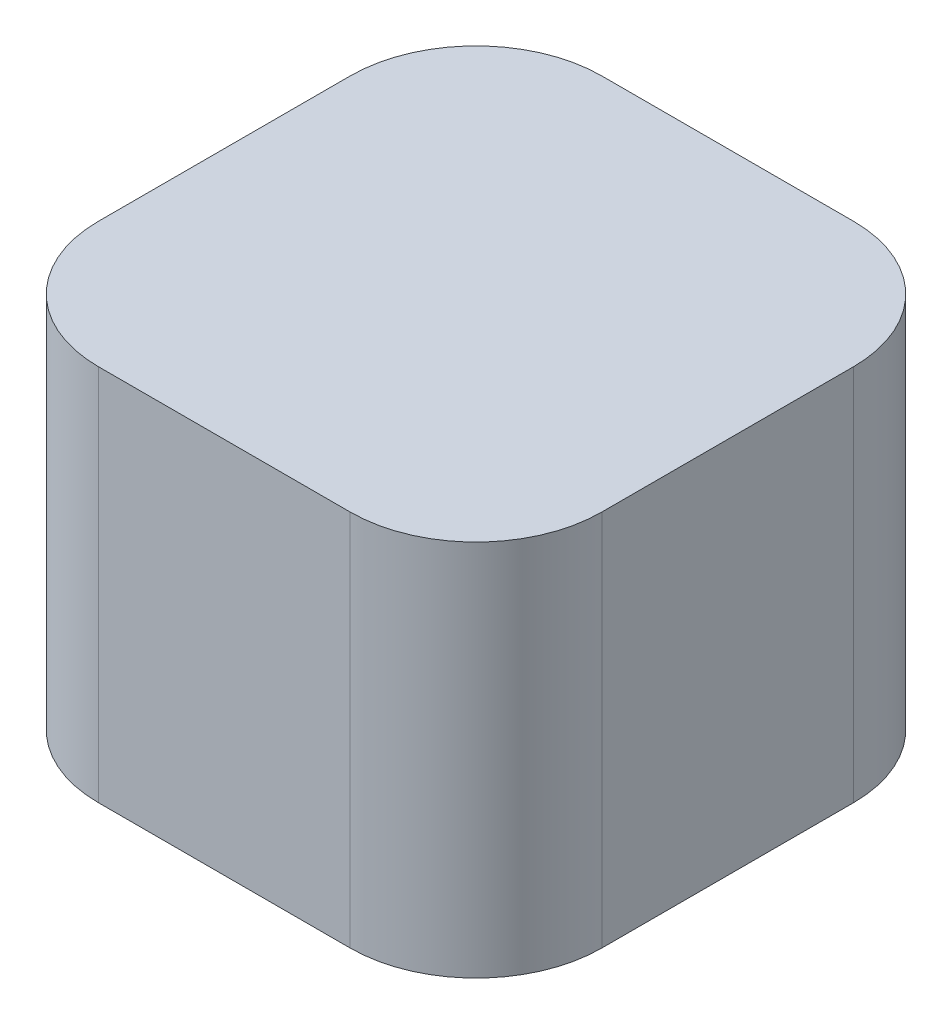
ISO-10303-21;
HEADER;
FILE_DESCRIPTION(('STEP AP214'),'2;1');
FILE_NAME('part.step','',(''),(''),'','','');
FILE_SCHEMA(('AUTOMOTIVE_DESIGN { 1 0 10303 214 1 1 1 1 }'));
ENDSEC;
DATA;
#1=APPLICATION_CONTEXT('core data for automotive mechanical design processes');
#2=APPLICATION_PROTOCOL_DEFINITION('international standard','automotive_design',2000,#1);
#3=PRODUCT_CONTEXT('',#1,'mechanical');
#4=PRODUCT('Part','Part','',(#3));
#5=PRODUCT_RELATED_PRODUCT_CATEGORY('part','',(#4));
#6=PRODUCT_DEFINITION_FORMATION('','',#4);
#7=PRODUCT_DEFINITION_CONTEXT('part definition',#1,'design');
#8=PRODUCT_DEFINITION('design','',#6,#7);
#9=PRODUCT_DEFINITION_SHAPE('','',#8);
#10=(LENGTH_UNIT() NAMED_UNIT(*) SI_UNIT(.MILLI.,.METRE.));
#11=(NAMED_UNIT(*) PLANE_ANGLE_UNIT() SI_UNIT($,.RADIAN.));
#12=(NAMED_UNIT(*) SI_UNIT($,.STERADIAN.) SOLID_ANGLE_UNIT());
#13=UNCERTAINTY_MEASURE_WITH_UNIT(LENGTH_MEASURE(1.E-05),#10,'distance_accuracy_value','');
#14=(GEOMETRIC_REPRESENTATION_CONTEXT(3) GLOBAL_UNCERTAINTY_ASSIGNED_CONTEXT((#13)) GLOBAL_UNIT_ASSIGNED_CONTEXT((#10,
#11,#12)) REPRESENTATION_CONTEXT('',''));
#15=CARTESIAN_POINT('',(0.,0.,0.));
#16=DIRECTION('',(0.,0.,1.));
#17=DIRECTION('',(1.,0.,0.));
#18=AXIS2_PLACEMENT_3D('',#15,#16,#17);
#19=CARTESIAN_POINT('',(20.,30.,20.));
#20=DIRECTION('',(-1.,0.,0.));
#21=DIRECTION('',(0.,0.,1.));
#22=AXIS2_PLACEMENT_3D('',#19,#20,#21);
#23=PLANE('',#22);
#24=DIRECTION('',(0.,0.,-1.));
#25=VECTOR('',#24,1.);
#26=CARTESIAN_POINT('',(20.,0.,20.));
#27=LINE('',#26,#25);
#28=CARTESIAN_POINT('',(20.,0.,10.));
#29=VERTEX_POINT('',#28);
#30=CARTESIAN_POINT('',(20.,0.,-10.));
#31=VERTEX_POINT('',#30);
#32=EDGE_CURVE('E130',#29,#31,#27,.T.);
#33=ORIENTED_EDGE('',*,*,#32,.T.);
#34=DIRECTION('',(0.,-1.,0.));
#35=VECTOR('',#34,1.);
#36=CARTESIAN_POINT('',(20.,30.,-10.));
#37=LINE('',#36,#35);
#38=CARTESIAN_POINT('',(20.,30.,-10.));
#39=VERTEX_POINT('',#38);
#40=EDGE_CURVE('E152',#31,#39,#37,.F.);
#41=ORIENTED_EDGE('',*,*,#40,.T.);
#42=DIRECTION('',(0.,0.,-1.));
#43=VECTOR('',#42,1.);
#44=CARTESIAN_POINT('',(20.,30.,20.));
#45=LINE('',#44,#43);
#46=CARTESIAN_POINT('',(20.,30.,10.));
#47=VERTEX_POINT('',#46);
#48=EDGE_CURVE('E128',#47,#39,#45,.T.);
#49=ORIENTED_EDGE('',*,*,#48,.F.);
#50=DIRECTION('',(0.,-1.,0.));
#51=VECTOR('',#50,1.);
#52=CARTESIAN_POINT('',(20.,30.,10.));
#53=LINE('',#52,#51);
#54=EDGE_CURVE('E149',#47,#29,#53,.T.);
#55=ORIENTED_EDGE('',*,*,#54,.T.);
#56=EDGE_LOOP('',(#33,#41,#49,#55));
#57=FACE_BOUND('',#56,.T.);
#58=ADVANCED_FACE('F33',(#57),#23,.F.);
#59=CARTESIAN_POINT('',(-20.,30.,-20.));
#60=DIRECTION('',(0.,0.,1.));
#61=DIRECTION('',(1.,0.,0.));
#62=AXIS2_PLACEMENT_3D('',#59,#60,#61);
#63=PLANE('',#62);
#64=DIRECTION('',(-1.,0.,0.));
#65=VECTOR('',#64,1.);
#66=CARTESIAN_POINT('',(-20.,0.,-20.));
#67=LINE('',#66,#65);
#68=CARTESIAN_POINT('',(10.,0.,-20.));
#69=VERTEX_POINT('',#68);
#70=CARTESIAN_POINT('',(-10.,0.,-20.));
#71=VERTEX_POINT('',#70);
#72=EDGE_CURVE('E126',#69,#71,#67,.T.);
#73=ORIENTED_EDGE('',*,*,#72,.T.);
#74=DIRECTION('',(0.,-1.,0.));
#75=VECTOR('',#74,1.);
#76=CARTESIAN_POINT('',(-10.,30.,-20.));
#77=LINE('',#76,#75);
#78=CARTESIAN_POINT('',(-10.,30.,-20.));
#79=VERTEX_POINT('',#78);
#80=EDGE_CURVE('E104',#71,#79,#77,.F.);
#81=ORIENTED_EDGE('',*,*,#80,.T.);
#82=DIRECTION('',(-1.,0.,0.));
#83=VECTOR('',#82,1.);
#84=CARTESIAN_POINT('',(-20.,30.,-20.));
#85=LINE('',#84,#83);
#86=CARTESIAN_POINT('',(10.,30.,-20.));
#87=VERTEX_POINT('',#86);
#88=EDGE_CURVE('E166',#87,#79,#85,.T.);
#89=ORIENTED_EDGE('',*,*,#88,.F.);
#90=DIRECTION('',(0.,-1.,0.));
#91=VECTOR('',#90,1.);
#92=CARTESIAN_POINT('',(10.,30.,-20.));
#93=LINE('',#92,#91);
#94=EDGE_CURVE('E109',#87,#69,#93,.T.);
#95=ORIENTED_EDGE('',*,*,#94,.T.);
#96=EDGE_LOOP('',(#73,#81,#89,#95));
#97=FACE_BOUND('',#96,.T.);
#98=ADVANCED_FACE('F171',(#97),#63,.F.);
#99=CARTESIAN_POINT('',(-20.,30.,20.));
#100=DIRECTION('',(1.,0.,0.));
#101=DIRECTION('',(0.,0.,-1.));
#102=AXIS2_PLACEMENT_3D('',#99,#100,#101);
#103=PLANE('',#102);
#104=DIRECTION('',(0.,0.,1.));
#105=VECTOR('',#104,1.);
#106=CARTESIAN_POINT('',(-20.,30.,20.));
#107=LINE('',#106,#105);
#108=CARTESIAN_POINT('',(-20.,30.,-10.));
#109=VERTEX_POINT('',#108);
#110=CARTESIAN_POINT('',(-20.,30.,10.));
#111=VERTEX_POINT('',#110);
#112=EDGE_CURVE('E118',#109,#111,#107,.T.);
#113=ORIENTED_EDGE('',*,*,#112,.F.);
#114=DIRECTION('',(0.,-1.,0.));
#115=VECTOR('',#114,1.);
#116=CARTESIAN_POINT('',(-20.,30.,-10.));
#117=LINE('',#116,#115);
#118=CARTESIAN_POINT('',(-20.,0.,-10.));
#119=VERTEX_POINT('',#118);
#120=EDGE_CURVE('E103',#109,#119,#117,.T.);
#121=ORIENTED_EDGE('',*,*,#120,.T.);
#122=DIRECTION('',(0.,0.,1.));
#123=VECTOR('',#122,1.);
#124=CARTESIAN_POINT('',(-20.,0.,20.));
#125=LINE('',#124,#123);
#126=CARTESIAN_POINT('',(-20.,0.,10.));
#127=VERTEX_POINT('',#126);
#128=EDGE_CURVE('E116',#119,#127,#125,.T.);
#129=ORIENTED_EDGE('',*,*,#128,.T.);
#130=DIRECTION('',(0.,-1.,0.));
#131=VECTOR('',#130,1.);
#132=CARTESIAN_POINT('',(-20.,30.,10.));
#133=LINE('',#132,#131);
#134=EDGE_CURVE('E120',#127,#111,#133,.F.);
#135=ORIENTED_EDGE('',*,*,#134,.T.);
#136=EDGE_LOOP('',(#113,#121,#129,#135));
#137=FACE_BOUND('',#136,.T.);
#138=ADVANCED_FACE('F115',(#137),#103,.F.);
#139=CARTESIAN_POINT('',(-20.,30.,20.));
#140=DIRECTION('',(0.,0.,-1.));
#141=DIRECTION('',(-1.,0.,0.));
#142=AXIS2_PLACEMENT_3D('',#139,#140,#141);
#143=PLANE('',#142);
#144=DIRECTION('',(1.,0.,0.));
#145=VECTOR('',#144,1.);
#146=CARTESIAN_POINT('',(-20.,30.,20.));
#147=LINE('',#146,#145);
#148=CARTESIAN_POINT('',(-10.,30.,20.));
#149=VERTEX_POINT('',#148);
#150=CARTESIAN_POINT('',(10.,30.,20.));
#151=VERTEX_POINT('',#150);
#152=EDGE_CURVE('E134',#149,#151,#147,.T.);
#153=ORIENTED_EDGE('',*,*,#152,.F.);
#154=DIRECTION('',(0.,-1.,0.));
#155=VECTOR('',#154,1.);
#156=CARTESIAN_POINT('',(-10.,30.,20.));
#157=LINE('',#156,#155);
#158=CARTESIAN_POINT('',(-10.,0.,20.));
#159=VERTEX_POINT('',#158);
#160=EDGE_CURVE('E11',#149,#159,#157,.T.);
#161=ORIENTED_EDGE('',*,*,#160,.T.);
#162=DIRECTION('',(1.,0.,0.));
#163=VECTOR('',#162,1.);
#164=CARTESIAN_POINT('',(-20.,0.,20.));
#165=LINE('',#164,#163);
#166=CARTESIAN_POINT('',(10.,0.,20.));
#167=VERTEX_POINT('',#166);
#168=EDGE_CURVE('E125',#159,#167,#165,.T.);
#169=ORIENTED_EDGE('',*,*,#168,.T.);
#170=DIRECTION('',(0.,-1.,0.));
#171=VECTOR('',#170,1.);
#172=CARTESIAN_POINT('',(10.,30.,20.));
#173=LINE('',#172,#171);
#174=EDGE_CURVE('E41',#167,#151,#173,.F.);
#175=ORIENTED_EDGE('',*,*,#174,.T.);
#176=EDGE_LOOP('',(#153,#161,#169,#175));
#177=FACE_BOUND('',#176,.T.);
#178=ADVANCED_FACE('F194',(#177),#143,.F.);
#179=CARTESIAN_POINT('',(0.,30.,0.));
#180=DIRECTION('',(0.,-1.,0.));
#181=DIRECTION('',(0.,0.,-1.));
#182=AXIS2_PLACEMENT_3D('',#179,#180,#181);
#183=PLANE('',#182);
#184=ORIENTED_EDGE('',*,*,#88,.T.);
#185=CARTESIAN_POINT('',(-10.,30.,-10.));
#186=DIRECTION('',(0.,-1.,0.));
#187=DIRECTION('',(0.,0.,-1.));
#188=AXIS2_PLACEMENT_3D('',#185,#186,#187);
#189=CIRCLE('',#188,10.);
#190=EDGE_CURVE('E147',#79,#109,#189,.F.);
#191=ORIENTED_EDGE('',*,*,#190,.T.);
#192=ORIENTED_EDGE('',*,*,#112,.T.);
#193=CARTESIAN_POINT('',(-10.,30.,10.));
#194=DIRECTION('',(0.,-1.,0.));
#195=DIRECTION('',(0.,0.,-1.));
#196=AXIS2_PLACEMENT_3D('',#193,#194,#195);
#197=CIRCLE('',#196,10.);
#198=EDGE_CURVE('E54',#111,#149,#197,.F.);
#199=ORIENTED_EDGE('',*,*,#198,.T.);
#200=ORIENTED_EDGE('',*,*,#152,.T.);
#201=CARTESIAN_POINT('',(10.,30.,10.));
#202=DIRECTION('',(0.,-1.,0.));
#203=DIRECTION('',(0.,0.,-1.));
#204=AXIS2_PLACEMENT_3D('',#201,#202,#203);
#205=CIRCLE('',#204,10.);
#206=EDGE_CURVE('E142',#151,#47,#205,.F.);
#207=ORIENTED_EDGE('',*,*,#206,.T.);
#208=ORIENTED_EDGE('',*,*,#48,.T.);
#209=CARTESIAN_POINT('',(10.,30.,-10.));
#210=DIRECTION('',(0.,-1.,0.));
#211=DIRECTION('',(0.,0.,-1.));
#212=AXIS2_PLACEMENT_3D('',#209,#210,#211);
#213=CIRCLE('',#212,10.);
#214=EDGE_CURVE('E145',#39,#87,#213,.F.);
#215=ORIENTED_EDGE('',*,*,#214,.T.);
#216=EDGE_LOOP('',(#184,#191,#192,#199,#200,#207,#208,#215));
#217=FACE_BOUND('',#216,.T.);
#218=ADVANCED_FACE('F163',(#217),#183,.F.);
#219=CARTESIAN_POINT('',(0.,0.,0.));
#220=DIRECTION('',(0.,-1.,0.));
#221=DIRECTION('',(0.,0.,-1.));
#222=AXIS2_PLACEMENT_3D('',#219,#220,#221);
#223=PLANE('',#222);
#224=CARTESIAN_POINT('',(0.,0.,0.));
#225=DIRECTION('',(0.,-1.,0.));
#226=DIRECTION('',(0.,0.,-1.));
#227=AXIS2_PLACEMENT_3D('',#224,#225,#226);
#228=CIRCLE('',#227,10.);
#229=CARTESIAN_POINT('',(0.,0.,-10.));
#230=VERTEX_POINT('',#229);
#231=EDGE_CURVE('E174',#230,#230,#228,.T.);
#232=ORIENTED_EDGE('',*,*,#231,.F.);
#233=EDGE_LOOP('',(#232));
#234=FACE_BOUND('',#233,.T.);
#235=ORIENTED_EDGE('',*,*,#128,.F.);
#236=CARTESIAN_POINT('',(-10.,0.,-10.));
#237=DIRECTION('',(0.,-1.,0.));
#238=DIRECTION('',(0.,0.,-1.));
#239=AXIS2_PLACEMENT_3D('',#236,#237,#238);
#240=CIRCLE('',#239,10.);
#241=EDGE_CURVE('E99',#119,#71,#240,.T.);
#242=ORIENTED_EDGE('',*,*,#241,.T.);
#243=ORIENTED_EDGE('',*,*,#72,.F.);
#244=CARTESIAN_POINT('',(10.,0.,-10.));
#245=DIRECTION('',(0.,-1.,0.));
#246=DIRECTION('',(0.,0.,-1.));
#247=AXIS2_PLACEMENT_3D('',#244,#245,#246);
#248=CIRCLE('',#247,10.);
#249=EDGE_CURVE('E110',#69,#31,#248,.T.);
#250=ORIENTED_EDGE('',*,*,#249,.T.);
#251=ORIENTED_EDGE('',*,*,#32,.F.);
#252=CARTESIAN_POINT('',(10.,0.,10.));
#253=DIRECTION('',(0.,-1.,0.));
#254=DIRECTION('',(0.,0.,-1.));
#255=AXIS2_PLACEMENT_3D('',#252,#253,#254);
#256=CIRCLE('',#255,10.);
#257=EDGE_CURVE('E119',#29,#167,#256,.T.);
#258=ORIENTED_EDGE('',*,*,#257,.T.);
#259=ORIENTED_EDGE('',*,*,#168,.F.);
#260=CARTESIAN_POINT('',(-10.,0.,10.));
#261=DIRECTION('',(0.,-1.,0.));
#262=DIRECTION('',(0.,0.,-1.));
#263=AXIS2_PLACEMENT_3D('',#260,#261,#262);
#264=CIRCLE('',#263,10.);
#265=EDGE_CURVE('E124',#159,#127,#264,.T.);
#266=ORIENTED_EDGE('',*,*,#265,.T.);
#267=EDGE_LOOP('',(#235,#242,#243,#250,#251,#258,#259,#266));
#268=FACE_BOUND('',#267,.T.);
#269=ADVANCED_FACE('F122',(#234,#268),#223,.T.);
#270=CARTESIAN_POINT('',(0.,-10.,0.));
#271=DIRECTION('',(0.,1.,0.));
#272=DIRECTION('',(0.,0.,1.));
#273=AXIS2_PLACEMENT_3D('',#270,#271,#272);
#274=CYLINDRICAL_SURFACE('',#273,10.);
#275=CARTESIAN_POINT('',(0.,-10.,0.));
#276=DIRECTION('',(0.,-1.,0.));
#277=DIRECTION('',(0.,0.,-1.));
#278=AXIS2_PLACEMENT_3D('',#275,#276,#277);
#279=CIRCLE('',#278,10.);
#280=CARTESIAN_POINT('',(0.,-10.,-10.));
#281=VERTEX_POINT('',#280);
#282=EDGE_CURVE('E172',#281,#281,#279,.T.);
#283=ORIENTED_EDGE('',*,*,#282,.F.);
#284=EDGE_LOOP('',(#283));
#285=FACE_BOUND('',#284,.T.);
#286=ORIENTED_EDGE('',*,*,#231,.T.);
#287=EDGE_LOOP('',(#286));
#288=FACE_BOUND('',#287,.T.);
#289=ADVANCED_FACE('F183',(#285,#288),#274,.T.);
#290=CARTESIAN_POINT('',(0.,-10.,0.));
#291=DIRECTION('',(0.,-1.,0.));
#292=DIRECTION('',(0.,0.,-1.));
#293=AXIS2_PLACEMENT_3D('',#290,#291,#292);
#294=PLANE('',#293);
#295=ORIENTED_EDGE('',*,*,#282,.T.);
#296=EDGE_LOOP('',(#295));
#297=FACE_BOUND('',#296,.T.);
#298=ADVANCED_FACE('F191',(#297),#294,.T.);
#299=CARTESIAN_POINT('',(-10.,30.,-10.));
#300=DIRECTION('',(0.,-1.,0.));
#301=DIRECTION('',(0.,0.,-1.));
#302=AXIS2_PLACEMENT_3D('',#299,#300,#301);
#303=CYLINDRICAL_SURFACE('',#302,10.);
#304=ORIENTED_EDGE('',*,*,#190,.F.);
#305=ORIENTED_EDGE('',*,*,#80,.F.);
#306=ORIENTED_EDGE('',*,*,#241,.F.);
#307=ORIENTED_EDGE('',*,*,#120,.F.);
#308=EDGE_LOOP('',(#304,#305,#306,#307));
#309=FACE_BOUND('',#308,.T.);
#310=ADVANCED_FACE('F102',(#309),#303,.T.);
#311=CARTESIAN_POINT('',(10.,30.,-10.));
#312=DIRECTION('',(0.,-1.,0.));
#313=DIRECTION('',(0.,0.,-1.));
#314=AXIS2_PLACEMENT_3D('',#311,#312,#313);
#315=CYLINDRICAL_SURFACE('',#314,10.);
#316=ORIENTED_EDGE('',*,*,#214,.F.);
#317=ORIENTED_EDGE('',*,*,#40,.F.);
#318=ORIENTED_EDGE('',*,*,#249,.F.);
#319=ORIENTED_EDGE('',*,*,#94,.F.);
#320=EDGE_LOOP('',(#316,#317,#318,#319));
#321=FACE_BOUND('',#320,.T.);
#322=ADVANCED_FACE('F169',(#321),#315,.T.);
#323=CARTESIAN_POINT('',(-10.,30.,10.));
#324=DIRECTION('',(0.,-1.,0.));
#325=DIRECTION('',(0.,0.,-1.));
#326=AXIS2_PLACEMENT_3D('',#323,#324,#325);
#327=CYLINDRICAL_SURFACE('',#326,10.);
#328=ORIENTED_EDGE('',*,*,#198,.F.);
#329=ORIENTED_EDGE('',*,*,#134,.F.);
#330=ORIENTED_EDGE('',*,*,#265,.F.);
#331=ORIENTED_EDGE('',*,*,#160,.F.);
#332=EDGE_LOOP('',(#328,#329,#330,#331));
#333=FACE_BOUND('',#332,.T.);
#334=ADVANCED_FACE('F208',(#333),#327,.T.);
#335=CARTESIAN_POINT('',(10.,30.,10.));
#336=DIRECTION('',(0.,-1.,0.));
#337=DIRECTION('',(0.,0.,-1.));
#338=AXIS2_PLACEMENT_3D('',#335,#336,#337);
#339=CYLINDRICAL_SURFACE('',#338,10.);
#340=ORIENTED_EDGE('',*,*,#206,.F.);
#341=ORIENTED_EDGE('',*,*,#174,.F.);
#342=ORIENTED_EDGE('',*,*,#257,.F.);
#343=ORIENTED_EDGE('',*,*,#54,.F.);
#344=EDGE_LOOP('',(#340,#341,#342,#343));
#345=FACE_BOUND('',#344,.T.);
#346=ADVANCED_FACE('F35',(#345),#339,.T.);
#347=CLOSED_SHELL('',(#58,#98,#138,#178,#218,#269,#289,#298,#310,#322,#334,#346));
#348=MANIFOLD_SOLID_BREP('B2',#347);
#349=ADVANCED_BREP_SHAPE_REPRESENTATION('',(#18,#348),#14);
#350=SHAPE_DEFINITION_REPRESENTATION(#9,#349);
ENDSEC;
END-ISO-10303-21;
